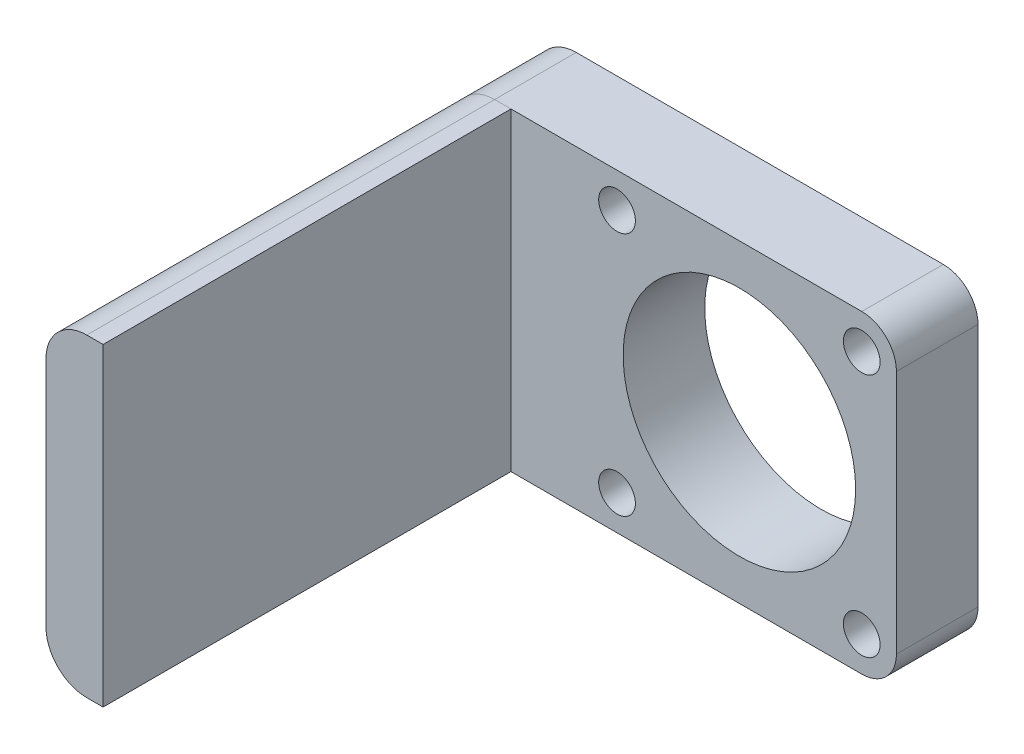
ISO-10303-21;
HEADER;
FILE_DESCRIPTION(('STEP AP214'),'2;1');
FILE_NAME('part.step','',(''),(''),'','','');
FILE_SCHEMA(('AUTOMOTIVE_DESIGN { 1 0 10303 214 1 1 1 1 }'));
ENDSEC;
DATA;
#1=APPLICATION_CONTEXT('core data for automotive mechanical design processes');
#2=APPLICATION_PROTOCOL_DEFINITION('international standard','automotive_design',2000,#1);
#3=PRODUCT_CONTEXT('',#1,'mechanical');
#4=PRODUCT('Part','Part','',(#3));
#5=PRODUCT_RELATED_PRODUCT_CATEGORY('part','',(#4));
#6=PRODUCT_DEFINITION_FORMATION('','',#4);
#7=PRODUCT_DEFINITION_CONTEXT('part definition',#1,'design');
#8=PRODUCT_DEFINITION('design','',#6,#7);
#9=PRODUCT_DEFINITION_SHAPE('','',#8);
#10=(LENGTH_UNIT() NAMED_UNIT(*) SI_UNIT(.MILLI.,.METRE.));
#11=(NAMED_UNIT(*) PLANE_ANGLE_UNIT() SI_UNIT($,.RADIAN.));
#12=(NAMED_UNIT(*) SI_UNIT($,.STERADIAN.) SOLID_ANGLE_UNIT());
#13=UNCERTAINTY_MEASURE_WITH_UNIT(LENGTH_MEASURE(1.E-05),#10,'distance_accuracy_value','');
#14=(GEOMETRIC_REPRESENTATION_CONTEXT(3) GLOBAL_UNCERTAINTY_ASSIGNED_CONTEXT((#13)) GLOBAL_UNIT_ASSIGNED_CONTEXT((#10,
#11,#12)) REPRESENTATION_CONTEXT('',''));
#15=CARTESIAN_POINT('',(0.,0.,0.));
#16=DIRECTION('',(0.,0.,1.));
#17=DIRECTION('',(1.,0.,0.));
#18=AXIS2_PLACEMENT_3D('',#15,#16,#17);
#19=CARTESIAN_POINT('',(-30.0000000000002,-14.2499999999987,60.));
#20=DIRECTION('',(0.,0.,-1.));
#21=DIRECTION('',(-1.,0.,0.));
#22=AXIS2_PLACEMENT_3D('',#19,#20,#21);
#23=CYLINDRICAL_SURFACE('',#22,5.);
#24=CARTESIAN_POINT('',(-30.0000000000002,-14.2499999999987,10.));
#25=DIRECTION('',(0.,0.,1.));
#26=DIRECTION('',(1.,0.,0.));
#27=AXIS2_PLACEMENT_3D('',#24,#25,#26);
#28=CIRCLE('',#27,5.);
#29=CARTESIAN_POINT('',(-35.0000000000002,-14.2499999999987,10.));
#30=VERTEX_POINT('',#29);
#31=CARTESIAN_POINT('',(-30.0000000000002,-19.2499999999987,10.));
#32=VERTEX_POINT('',#31);
#33=EDGE_CURVE('E129',#30,#32,#28,.T.);
#34=ORIENTED_EDGE('',*,*,#33,.T.);
#35=DIRECTION('',(0.,0.,-1.));
#36=VECTOR('',#35,1.);
#37=CARTESIAN_POINT('',(-30.0000000000002,-19.2499999999987,60.));
#38=LINE('',#37,#36);
#39=CARTESIAN_POINT('',(-30.0000000000002,-19.2499999999987,60.));
#40=VERTEX_POINT('',#39);
#41=EDGE_CURVE('E12',#40,#32,#38,.T.);
#42=ORIENTED_EDGE('',*,*,#41,.F.);
#43=CARTESIAN_POINT('',(-30.0000000000002,-14.2499999999987,60.));
#44=DIRECTION('',(0.,0.,1.));
#45=DIRECTION('',(1.,0.,0.));
#46=AXIS2_PLACEMENT_3D('',#43,#44,#45);
#47=CIRCLE('',#46,5.);
#48=CARTESIAN_POINT('',(-35.0000000000002,-14.2499999999987,60.));
#49=VERTEX_POINT('',#48);
#50=EDGE_CURVE('E140',#49,#40,#47,.T.);
#51=ORIENTED_EDGE('',*,*,#50,.F.);
#52=DIRECTION('',(0.,0.,-1.));
#53=VECTOR('',#52,1.);
#54=CARTESIAN_POINT('',(-35.0000000000002,-14.2499999999987,60.));
#55=LINE('',#54,#53);
#56=EDGE_CURVE('E125',#49,#30,#55,.T.);
#57=ORIENTED_EDGE('',*,*,#56,.T.);
#58=EDGE_LOOP('',(#34,#42,#51,#57));
#59=FACE_BOUND('',#58,.T.);
#60=ADVANCED_FACE('F45',(#59),#23,.T.);
#61=CARTESIAN_POINT('',(-30.0000000000002,-19.2499999999987,60.));
#62=DIRECTION('',(0.,1.,0.));
#63=DIRECTION('',(0.,0.,1.));
#64=AXIS2_PLACEMENT_3D('',#61,#62,#63);
#65=PLANE('',#64);
#66=DIRECTION('',(1.,0.,0.));
#67=VECTOR('',#66,1.);
#68=CARTESIAN_POINT('',(-30.0000000000002,-19.2499999999987,10.));
#69=LINE('',#68,#67);
#70=CARTESIAN_POINT('',(-28.0000000000002,-19.2499999999987,10.));
#71=VERTEX_POINT('',#70);
#72=EDGE_CURVE('E132',#32,#71,#69,.T.);
#73=ORIENTED_EDGE('',*,*,#72,.T.);
#74=DIRECTION('',(0.,0.,-1.));
#75=VECTOR('',#74,1.);
#76=CARTESIAN_POINT('',(-28.0000000000002,-19.2499999999987,60.));
#77=LINE('',#76,#75);
#78=CARTESIAN_POINT('',(-28.0000000000002,-19.2499999999987,60.));
#79=VERTEX_POINT('',#78);
#80=EDGE_CURVE('E53',#79,#71,#77,.T.);
#81=ORIENTED_EDGE('',*,*,#80,.F.);
#82=DIRECTION('',(1.,0.,0.));
#83=VECTOR('',#82,1.);
#84=CARTESIAN_POINT('',(-30.0000000000002,-19.2499999999987,60.));
#85=LINE('',#84,#83);
#86=EDGE_CURVE('E98',#40,#79,#85,.T.);
#87=ORIENTED_EDGE('',*,*,#86,.F.);
#88=ORIENTED_EDGE('',*,*,#41,.T.);
#89=EDGE_LOOP('',(#73,#81,#87,#88));
#90=FACE_BOUND('',#89,.T.);
#91=ADVANCED_FACE('F146',(#90),#65,.F.);
#92=CARTESIAN_POINT('',(-28.0000000000002,0.,60.));
#93=DIRECTION('',(-1.,0.,0.));
#94=DIRECTION('',(0.,0.,1.));
#95=AXIS2_PLACEMENT_3D('',#92,#93,#94);
#96=PLANE('',#95);
#97=DIRECTION('',(0.,1.,0.));
#98=VECTOR('',#97,1.);
#99=CARTESIAN_POINT('',(-28.0000000000002,0.,10.));
#100=LINE('',#99,#98);
#101=CARTESIAN_POINT('',(-28.0000000000002,19.2499999999982,10.));
#102=VERTEX_POINT('',#101);
#103=EDGE_CURVE('E135',#71,#102,#100,.T.);
#104=ORIENTED_EDGE('',*,*,#103,.T.);
#105=DIRECTION('',(0.,0.,-1.));
#106=VECTOR('',#105,1.);
#107=CARTESIAN_POINT('',(-28.0000000000002,19.2499999999982,60.));
#108=LINE('',#107,#106);
#109=CARTESIAN_POINT('',(-28.0000000000002,19.2499999999982,60.));
#110=VERTEX_POINT('',#109);
#111=EDGE_CURVE('E120',#110,#102,#108,.T.);
#112=ORIENTED_EDGE('',*,*,#111,.F.);
#113=DIRECTION('',(0.,1.,0.));
#114=VECTOR('',#113,1.);
#115=CARTESIAN_POINT('',(-28.0000000000002,0.,60.));
#116=LINE('',#115,#114);
#117=EDGE_CURVE('E111',#79,#110,#116,.T.);
#118=ORIENTED_EDGE('',*,*,#117,.F.);
#119=ORIENTED_EDGE('',*,*,#80,.T.);
#120=EDGE_LOOP('',(#104,#112,#118,#119));
#121=FACE_BOUND('',#120,.T.);
#122=ADVANCED_FACE('F145',(#121),#96,.F.);
#123=CARTESIAN_POINT('',(-28.0000000000002,19.2499999999982,60.));
#124=DIRECTION('',(0.,-1.,0.));
#125=DIRECTION('',(0.,0.,-1.));
#126=AXIS2_PLACEMENT_3D('',#123,#124,#125);
#127=PLANE('',#126);
#128=DIRECTION('',(-1.,0.,0.));
#129=VECTOR('',#128,1.);
#130=CARTESIAN_POINT('',(-28.0000000000002,19.2499999999982,10.));
#131=LINE('',#130,#129);
#132=CARTESIAN_POINT('',(-30.0000000000002,19.2499999999982,10.));
#133=VERTEX_POINT('',#132);
#134=EDGE_CURVE('E119',#102,#133,#131,.T.);
#135=ORIENTED_EDGE('',*,*,#134,.T.);
#136=DIRECTION('',(0.,0.,-1.));
#137=VECTOR('',#136,1.);
#138=CARTESIAN_POINT('',(-30.0000000000002,19.2499999999982,60.));
#139=LINE('',#138,#137);
#140=CARTESIAN_POINT('',(-30.0000000000002,19.2499999999982,60.));
#141=VERTEX_POINT('',#140);
#142=EDGE_CURVE('E116',#141,#133,#139,.T.);
#143=ORIENTED_EDGE('',*,*,#142,.F.);
#144=DIRECTION('',(-1.,0.,0.));
#145=VECTOR('',#144,1.);
#146=CARTESIAN_POINT('',(-28.0000000000002,19.2499999999982,60.));
#147=LINE('',#146,#145);
#148=EDGE_CURVE('E105',#110,#141,#147,.T.);
#149=ORIENTED_EDGE('',*,*,#148,.F.);
#150=ORIENTED_EDGE('',*,*,#111,.T.);
#151=EDGE_LOOP('',(#135,#143,#149,#150));
#152=FACE_BOUND('',#151,.T.);
#153=ADVANCED_FACE('F117',(#152),#127,.F.);
#154=CARTESIAN_POINT('',(-30.0000000000002,14.2499999999982,60.));
#155=DIRECTION('',(0.,0.,-1.));
#156=DIRECTION('',(-1.,0.,0.));
#157=AXIS2_PLACEMENT_3D('',#154,#155,#156);
#158=CYLINDRICAL_SURFACE('',#157,5.);
#159=CARTESIAN_POINT('',(-30.0000000000002,14.2499999999982,10.));
#160=DIRECTION('',(0.,0.,1.));
#161=DIRECTION('',(1.,0.,0.));
#162=AXIS2_PLACEMENT_3D('',#159,#160,#161);
#163=CIRCLE('',#162,5.);
#164=CARTESIAN_POINT('',(-35.0000000000002,14.2499999999981,10.));
#165=VERTEX_POINT('',#164);
#166=EDGE_CURVE('E84',#133,#165,#163,.T.);
#167=ORIENTED_EDGE('',*,*,#166,.T.);
#168=DIRECTION('',(0.,0.,-1.));
#169=VECTOR('',#168,1.);
#170=CARTESIAN_POINT('',(-35.0000000000002,14.2499999999981,60.));
#171=LINE('',#170,#169);
#172=CARTESIAN_POINT('',(-35.0000000000002,14.2499999999981,60.));
#173=VERTEX_POINT('',#172);
#174=EDGE_CURVE('E121',#173,#165,#171,.T.);
#175=ORIENTED_EDGE('',*,*,#174,.F.);
#176=CARTESIAN_POINT('',(-30.0000000000002,14.2499999999982,60.));
#177=DIRECTION('',(0.,0.,1.));
#178=DIRECTION('',(1.,0.,0.));
#179=AXIS2_PLACEMENT_3D('',#176,#177,#178);
#180=CIRCLE('',#179,5.);
#181=EDGE_CURVE('E109',#141,#173,#180,.T.);
#182=ORIENTED_EDGE('',*,*,#181,.F.);
#183=ORIENTED_EDGE('',*,*,#142,.T.);
#184=EDGE_LOOP('',(#167,#175,#182,#183));
#185=FACE_BOUND('',#184,.T.);
#186=ADVANCED_FACE('F123',(#185),#158,.T.);
#187=CARTESIAN_POINT('',(-35.0000000000002,14.2499999999981,60.));
#188=DIRECTION('',(1.,0.,0.));
#189=DIRECTION('',(0.,0.,-1.));
#190=AXIS2_PLACEMENT_3D('',#187,#188,#189);
#191=PLANE('',#190);
#192=DIRECTION('',(0.,-1.,0.));
#193=VECTOR('',#192,1.);
#194=CARTESIAN_POINT('',(-35.0000000000002,14.2499999999981,10.));
#195=LINE('',#194,#193);
#196=EDGE_CURVE('E90',#165,#30,#195,.T.);
#197=ORIENTED_EDGE('',*,*,#196,.T.);
#198=ORIENTED_EDGE('',*,*,#56,.F.);
#199=DIRECTION('',(0.,-1.,0.));
#200=VECTOR('',#199,1.);
#201=CARTESIAN_POINT('',(-35.0000000000002,14.2499999999981,60.));
#202=LINE('',#201,#200);
#203=EDGE_CURVE('E61',#173,#49,#202,.T.);
#204=ORIENTED_EDGE('',*,*,#203,.F.);
#205=ORIENTED_EDGE('',*,*,#174,.T.);
#206=EDGE_LOOP('',(#197,#198,#204,#205));
#207=FACE_BOUND('',#206,.T.);
#208=ADVANCED_FACE('F153',(#207),#191,.F.);
#209=CARTESIAN_POINT('',(-30.0000000000002,-14.2499999999987,60.));
#210=DIRECTION('',(0.,0.,1.));
#211=DIRECTION('',(1.,0.,0.));
#212=AXIS2_PLACEMENT_3D('',#209,#210,#211);
#213=PLANE('',#212);
#214=ORIENTED_EDGE('',*,*,#50,.T.);
#215=ORIENTED_EDGE('',*,*,#86,.T.);
#216=ORIENTED_EDGE('',*,*,#117,.T.);
#217=ORIENTED_EDGE('',*,*,#148,.T.);
#218=ORIENTED_EDGE('',*,*,#181,.T.);
#219=ORIENTED_EDGE('',*,*,#203,.T.);
#220=EDGE_LOOP('',(#214,#215,#216,#217,#218,#219));
#221=FACE_BOUND('',#220,.T.);
#222=ADVANCED_FACE('F107',(#221),#213,.T.);
#223=CARTESIAN_POINT('',(-30.0000000000002,-14.2499999999987,10.));
#224=DIRECTION('',(0.,0.,1.));
#225=DIRECTION('',(1.,0.,0.));
#226=AXIS2_PLACEMENT_3D('',#223,#224,#225);
#227=PLANE('',#226);
#228=ORIENTED_EDGE('',*,*,#33,.F.);
#229=ORIENTED_EDGE('',*,*,#196,.F.);
#230=ORIENTED_EDGE('',*,*,#166,.F.);
#231=ORIENTED_EDGE('',*,*,#134,.F.);
#232=ORIENTED_EDGE('',*,*,#103,.F.);
#233=ORIENTED_EDGE('',*,*,#72,.F.);
#234=EDGE_LOOP('',(#228,#229,#230,#231,#232,#233));
#235=FACE_BOUND('',#234,.T.);
#236=ADVANCED_FACE('F150',(#235),#227,.F.);
#237=CLOSED_SHELL('',(#60,#91,#122,#153,#186,#208,#222,#236));
#238=MANIFOLD_SOLID_BREP('B2',#237);
#239=CARTESIAN_POINT('',(0.,19.2499999999982,10.));
#240=DIRECTION('',(0.,-1.,0.));
#241=DIRECTION('',(0.,0.,-1.));
#242=AXIS2_PLACEMENT_3D('',#239,#240,#241);
#243=PLANE('',#242);
#244=DIRECTION('',(-1.,0.,0.));
#245=VECTOR('',#244,1.);
#246=CARTESIAN_POINT('',(0.,19.2499999999982,0.));
#247=LINE('',#246,#245);
#248=CARTESIAN_POINT('',(15.0000000000002,19.2499999999982,0.));
#249=VERTEX_POINT('',#248);
#250=CARTESIAN_POINT('',(-30.0000000000002,19.2499999999982,0.));
#251=VERTEX_POINT('',#250);
#252=EDGE_CURVE('E336',#249,#251,#247,.T.);
#253=ORIENTED_EDGE('',*,*,#252,.T.);
#254=DIRECTION('',(0.,0.,-1.));
#255=VECTOR('',#254,1.);
#256=CARTESIAN_POINT('',(-30.0000000000002,19.2499999999982,10.));
#257=LINE('',#256,#255);
#258=CARTESIAN_POINT('',(-30.0000000000002,19.2499999999982,10.));
#259=VERTEX_POINT('',#258);
#260=EDGE_CURVE('E43',#259,#251,#257,.T.);
#261=ORIENTED_EDGE('',*,*,#260,.F.);
#262=DIRECTION('',(-1.,0.,0.));
#263=VECTOR('',#262,1.);
#264=CARTESIAN_POINT('',(0.,19.2499999999982,10.));
#265=LINE('',#264,#263);
#266=CARTESIAN_POINT('',(15.0000000000002,19.2499999999982,10.));
#267=VERTEX_POINT('',#266);
#268=EDGE_CURVE('E380',#267,#259,#265,.T.);
#269=ORIENTED_EDGE('',*,*,#268,.F.);
#270=DIRECTION('',(0.,0.,-1.));
#271=VECTOR('',#270,1.);
#272=CARTESIAN_POINT('',(15.0000000000002,19.2499999999982,10.));
#273=LINE('',#272,#271);
#274=EDGE_CURVE('E317',#267,#249,#273,.T.);
#275=ORIENTED_EDGE('',*,*,#274,.T.);
#276=EDGE_LOOP('',(#253,#261,#269,#275));
#277=FACE_BOUND('',#276,.T.);
#278=ADVANCED_FACE('F224',(#277),#243,.F.);
#279=CARTESIAN_POINT('',(-30.0000000000002,14.2499999999982,10.));
#280=DIRECTION('',(0.,0.,-1.));
#281=DIRECTION('',(-1.,0.,0.));
#282=AXIS2_PLACEMENT_3D('',#279,#280,#281);
#283=CYLINDRICAL_SURFACE('',#282,5.);
#284=CARTESIAN_POINT('',(-30.0000000000002,14.2499999999982,0.));
#285=DIRECTION('',(0.,0.,1.));
#286=DIRECTION('',(1.,0.,0.));
#287=AXIS2_PLACEMENT_3D('',#284,#285,#286);
#288=CIRCLE('',#287,5.);
#289=CARTESIAN_POINT('',(-35.0000000000002,14.2499999999981,0.));
#290=VERTEX_POINT('',#289);
#291=EDGE_CURVE('E339',#251,#290,#288,.T.);
#292=ORIENTED_EDGE('',*,*,#291,.T.);
#293=DIRECTION('',(0.,0.,-1.));
#294=VECTOR('',#293,1.);
#295=CARTESIAN_POINT('',(-35.0000000000002,14.2499999999981,10.));
#296=LINE('',#295,#294);
#297=CARTESIAN_POINT('',(-35.0000000000002,14.2499999999981,10.));
#298=VERTEX_POINT('',#297);
#299=EDGE_CURVE('E233',#298,#290,#296,.T.);
#300=ORIENTED_EDGE('',*,*,#299,.F.);
#301=CARTESIAN_POINT('',(-30.0000000000002,14.2499999999982,10.));
#302=DIRECTION('',(0.,0.,1.));
#303=DIRECTION('',(1.,0.,0.));
#304=AXIS2_PLACEMENT_3D('',#301,#302,#303);
#305=CIRCLE('',#304,5.);
#306=EDGE_CURVE('E280',#259,#298,#305,.T.);
#307=ORIENTED_EDGE('',*,*,#306,.F.);
#308=ORIENTED_EDGE('',*,*,#260,.T.);
#309=EDGE_LOOP('',(#292,#300,#307,#308));
#310=FACE_BOUND('',#309,.T.);
#311=ADVANCED_FACE('F426',(#310),#283,.T.);
#312=CARTESIAN_POINT('',(-35.0000000000002,0.,10.));
#313=DIRECTION('',(1.,0.,0.));
#314=DIRECTION('',(0.,0.,-1.));
#315=AXIS2_PLACEMENT_3D('',#312,#313,#314);
#316=PLANE('',#315);
#317=DIRECTION('',(0.,-1.,0.));
#318=VECTOR('',#317,1.);
#319=CARTESIAN_POINT('',(-35.0000000000002,0.,0.));
#320=LINE('',#319,#318);
#321=CARTESIAN_POINT('',(-35.0000000000002,-14.2499999999987,0.));
#322=VERTEX_POINT('',#321);
#323=EDGE_CURVE('E341',#290,#322,#320,.T.);
#324=ORIENTED_EDGE('',*,*,#323,.T.);
#325=DIRECTION('',(0.,0.,-1.));
#326=VECTOR('',#325,1.);
#327=CARTESIAN_POINT('',(-35.0000000000002,-14.2499999999987,10.));
#328=LINE('',#327,#326);
#329=CARTESIAN_POINT('',(-35.0000000000002,-14.2499999999987,10.));
#330=VERTEX_POINT('',#329);
#331=EDGE_CURVE('E359',#330,#322,#328,.T.);
#332=ORIENTED_EDGE('',*,*,#331,.F.);
#333=DIRECTION('',(0.,-1.,0.));
#334=VECTOR('',#333,1.);
#335=CARTESIAN_POINT('',(-35.0000000000002,0.,10.));
#336=LINE('',#335,#334);
#337=EDGE_CURVE('E366',#298,#330,#336,.T.);
#338=ORIENTED_EDGE('',*,*,#337,.F.);
#339=ORIENTED_EDGE('',*,*,#299,.T.);
#340=EDGE_LOOP('',(#324,#332,#338,#339));
#341=FACE_BOUND('',#340,.T.);
#342=ADVANCED_FACE('F364',(#341),#316,.F.);
#343=CARTESIAN_POINT('',(-30.0000000000002,-14.2499999999987,10.));
#344=DIRECTION('',(0.,0.,-1.));
#345=DIRECTION('',(-1.,0.,0.));
#346=AXIS2_PLACEMENT_3D('',#343,#344,#345);
#347=CYLINDRICAL_SURFACE('',#346,5.);
#348=CARTESIAN_POINT('',(-30.0000000000002,-14.2499999999987,0.));
#349=DIRECTION('',(0.,0.,1.));
#350=DIRECTION('',(1.,0.,0.));
#351=AXIS2_PLACEMENT_3D('',#348,#349,#350);
#352=CIRCLE('',#351,5.);
#353=CARTESIAN_POINT('',(-30.0000000000002,-19.2499999999987,0.));
#354=VERTEX_POINT('',#353);
#355=EDGE_CURVE('E344',#354,#322,#352,.F.);
#356=ORIENTED_EDGE('',*,*,#355,.F.);
#357=DIRECTION('',(0.,0.,-1.));
#358=VECTOR('',#357,1.);
#359=CARTESIAN_POINT('',(-30.0000000000002,-19.2499999999987,10.));
#360=LINE('',#359,#358);
#361=CARTESIAN_POINT('',(-30.0000000000002,-19.2499999999987,10.));
#362=VERTEX_POINT('',#361);
#363=EDGE_CURVE('E357',#362,#354,#360,.T.);
#364=ORIENTED_EDGE('',*,*,#363,.F.);
#365=CARTESIAN_POINT('',(-30.0000000000002,-14.2499999999987,10.));
#366=DIRECTION('',(0.,0.,1.));
#367=DIRECTION('',(1.,0.,0.));
#368=AXIS2_PLACEMENT_3D('',#365,#366,#367);
#369=CIRCLE('',#368,5.);
#370=EDGE_CURVE('E375',#362,#330,#369,.F.);
#371=ORIENTED_EDGE('',*,*,#370,.T.);
#372=ORIENTED_EDGE('',*,*,#331,.T.);
#373=EDGE_LOOP('',(#356,#364,#371,#372));
#374=FACE_BOUND('',#373,.T.);
#375=ADVANCED_FACE('F373',(#374),#347,.T.);
#376=CARTESIAN_POINT('',(0.,-19.2499999999987,10.));
#377=DIRECTION('',(0.,1.,0.));
#378=DIRECTION('',(0.,0.,1.));
#379=AXIS2_PLACEMENT_3D('',#376,#377,#378);
#380=PLANE('',#379);
#381=DIRECTION('',(1.,0.,0.));
#382=VECTOR('',#381,1.);
#383=CARTESIAN_POINT('',(0.,-19.2499999999987,0.));
#384=LINE('',#383,#382);
#385=CARTESIAN_POINT('',(15.0000000000002,-19.2499999999987,0.));
#386=VERTEX_POINT('',#385);
#387=EDGE_CURVE('E347',#354,#386,#384,.T.);
#388=ORIENTED_EDGE('',*,*,#387,.T.);
#389=DIRECTION('',(0.,0.,-1.));
#390=VECTOR('',#389,1.);
#391=CARTESIAN_POINT('',(15.0000000000002,-19.2499999999987,10.));
#392=LINE('',#391,#390);
#393=CARTESIAN_POINT('',(15.0000000000002,-19.2499999999987,10.));
#394=VERTEX_POINT('',#393);
#395=EDGE_CURVE('E313',#394,#386,#392,.T.);
#396=ORIENTED_EDGE('',*,*,#395,.F.);
#397=DIRECTION('',(1.,0.,0.));
#398=VECTOR('',#397,1.);
#399=CARTESIAN_POINT('',(0.,-19.2499999999987,10.));
#400=LINE('',#399,#398);
#401=EDGE_CURVE('E300',#362,#394,#400,.T.);
#402=ORIENTED_EDGE('',*,*,#401,.F.);
#403=ORIENTED_EDGE('',*,*,#363,.T.);
#404=EDGE_LOOP('',(#388,#396,#402,#403));
#405=FACE_BOUND('',#404,.T.);
#406=ADVANCED_FACE('F465',(#405),#380,.F.);
#407=CARTESIAN_POINT('',(15.0000000000002,-14.9999999999982,10.));
#408=DIRECTION('',(0.,0.,-1.));
#409=DIRECTION('',(-1.,0.,0.));
#410=AXIS2_PLACEMENT_3D('',#407,#408,#409);
#411=CYLINDRICAL_SURFACE('',#410,4.25000000000049);
#412=CARTESIAN_POINT('',(15.0000000000002,-14.9999999999982,0.));
#413=DIRECTION('',(0.,0.,1.));
#414=DIRECTION('',(1.,0.,0.));
#415=AXIS2_PLACEMENT_3D('',#412,#413,#414);
#416=CIRCLE('',#415,4.25000000000049);
#417=CARTESIAN_POINT('',(19.2500000000007,-15.0000000000027,0.));
#418=VERTEX_POINT('',#417);
#419=EDGE_CURVE('E309',#386,#418,#416,.T.);
#420=ORIENTED_EDGE('',*,*,#419,.T.);
#421=DIRECTION('',(0.,0.,-1.));
#422=VECTOR('',#421,1.);
#423=CARTESIAN_POINT('',(19.2500000000007,-15.0000000000027,10.));
#424=LINE('',#423,#422);
#425=CARTESIAN_POINT('',(19.2500000000007,-15.0000000000027,10.));
#426=VERTEX_POINT('',#425);
#427=EDGE_CURVE('E306',#426,#418,#424,.T.);
#428=ORIENTED_EDGE('',*,*,#427,.F.);
#429=CARTESIAN_POINT('',(15.0000000000002,-14.9999999999982,10.));
#430=DIRECTION('',(0.,0.,1.));
#431=DIRECTION('',(1.,0.,0.));
#432=AXIS2_PLACEMENT_3D('',#429,#430,#431);
#433=CIRCLE('',#432,4.25000000000049);
#434=EDGE_CURVE('E293',#394,#426,#433,.T.);
#435=ORIENTED_EDGE('',*,*,#434,.F.);
#436=ORIENTED_EDGE('',*,*,#395,.T.);
#437=EDGE_LOOP('',(#420,#428,#435,#436));
#438=FACE_BOUND('',#437,.T.);
#439=ADVANCED_FACE('F307',(#438),#411,.T.);
#440=CARTESIAN_POINT('',(19.2500000000007,0.,10.));
#441=DIRECTION('',(1.,0.,0.));
#442=DIRECTION('',(0.,0.,-1.));
#443=AXIS2_PLACEMENT_3D('',#440,#441,#442);
#444=PLANE('',#443);
#445=DIRECTION('',(0.,-1.,0.));
#446=VECTOR('',#445,1.);
#447=CARTESIAN_POINT('',(19.2500000000007,0.,0.));
#448=LINE('',#447,#446);
#449=CARTESIAN_POINT('',(19.2500000000007,14.9999999999977,0.));
#450=VERTEX_POINT('',#449);
#451=EDGE_CURVE('E350',#450,#418,#448,.T.);
#452=ORIENTED_EDGE('',*,*,#451,.F.);
#453=DIRECTION('',(0.,0.,-1.));
#454=VECTOR('',#453,1.);
#455=CARTESIAN_POINT('',(19.2500000000007,14.9999999999977,10.));
#456=LINE('',#455,#454);
#457=CARTESIAN_POINT('',(19.2500000000007,14.9999999999977,10.));
#458=VERTEX_POINT('',#457);
#459=EDGE_CURVE('E269',#458,#450,#456,.T.);
#460=ORIENTED_EDGE('',*,*,#459,.F.);
#461=DIRECTION('',(0.,-1.,0.));
#462=VECTOR('',#461,1.);
#463=CARTESIAN_POINT('',(19.2500000000007,0.,10.));
#464=LINE('',#463,#462);
#465=EDGE_CURVE('E297',#458,#426,#464,.T.);
#466=ORIENTED_EDGE('',*,*,#465,.T.);
#467=ORIENTED_EDGE('',*,*,#427,.T.);
#468=EDGE_LOOP('',(#452,#460,#466,#467));
#469=FACE_BOUND('',#468,.T.);
#470=ADVANCED_FACE('F315',(#469),#444,.T.);
#471=CARTESIAN_POINT('',(15.0000000000002,-14.9999999999982,10.));
#472=DIRECTION('',(0.,0.,-1.));
#473=DIRECTION('',(-1.,0.,0.));
#474=AXIS2_PLACEMENT_3D('',#471,#472,#473);
#475=CYLINDRICAL_SURFACE('',#474,2.24999999999958);
#476=CARTESIAN_POINT('',(15.0000000000002,-14.9999999999982,10.));
#477=DIRECTION('',(0.,0.,1.));
#478=DIRECTION('',(1.,0.,0.));
#479=AXIS2_PLACEMENT_3D('',#476,#477,#478);
#480=CIRCLE('',#479,2.24999999999958);
#481=CARTESIAN_POINT('',(17.2499999999998,-14.9999999999982,10.));
#482=VERTEX_POINT('',#481);
#483=EDGE_CURVE('E382',#482,#482,#480,.T.);
#484=ORIENTED_EDGE('',*,*,#483,.T.);
#485=EDGE_LOOP('',(#484));
#486=FACE_BOUND('',#485,.T.);
#487=CARTESIAN_POINT('',(15.0000000000002,-14.9999999999982,0.));
#488=DIRECTION('',(0.,0.,1.));
#489=DIRECTION('',(1.,0.,0.));
#490=AXIS2_PLACEMENT_3D('',#487,#488,#489);
#491=CIRCLE('',#490,2.24999999999958);
#492=CARTESIAN_POINT('',(17.2499999999998,-14.9999999999982,0.));
#493=VERTEX_POINT('',#492);
#494=EDGE_CURVE('E333',#493,#493,#491,.T.);
#495=ORIENTED_EDGE('',*,*,#494,.F.);
#496=EDGE_LOOP('',(#495));
#497=FACE_BOUND('',#496,.T.);
#498=ADVANCED_FACE('F411',(#486,#497),#475,.F.);
#499=CARTESIAN_POINT('',(-14.999999999995,-14.9999999999984,10.));
#500=DIRECTION('',(0.,0.,-1.));
#501=DIRECTION('',(-1.,0.,0.));
#502=AXIS2_PLACEMENT_3D('',#499,#500,#501);
#503=CYLINDRICAL_SURFACE('',#502,2.24999999999502);
#504=CARTESIAN_POINT('',(-14.999999999995,-14.9999999999984,10.));
#505=DIRECTION('',(0.,0.,1.));
#506=DIRECTION('',(1.,0.,0.));
#507=AXIS2_PLACEMENT_3D('',#504,#505,#506);
#508=CIRCLE('',#507,2.24999999999502);
#509=CARTESIAN_POINT('',(-12.75,-14.9999999999984,10.));
#510=VERTEX_POINT('',#509);
#511=EDGE_CURVE('E385',#510,#510,#508,.T.);
#512=ORIENTED_EDGE('',*,*,#511,.T.);
#513=EDGE_LOOP('',(#512));
#514=FACE_BOUND('',#513,.T.);
#515=CARTESIAN_POINT('',(-14.999999999995,-14.9999999999984,0.));
#516=DIRECTION('',(0.,0.,1.));
#517=DIRECTION('',(1.,0.,0.));
#518=AXIS2_PLACEMENT_3D('',#515,#516,#517);
#519=CIRCLE('',#518,2.24999999999502);
#520=CARTESIAN_POINT('',(-12.75,-14.9999999999984,0.));
#521=VERTEX_POINT('',#520);
#522=EDGE_CURVE('E330',#521,#521,#519,.T.);
#523=ORIENTED_EDGE('',*,*,#522,.F.);
#524=EDGE_LOOP('',(#523));
#525=FACE_BOUND('',#524,.T.);
#526=ADVANCED_FACE('F414',(#514,#525),#503,.F.);
#527=CARTESIAN_POINT('',(-14.999999999995,14.9999999999975,10.));
#528=DIRECTION('',(0.,0.,-1.));
#529=DIRECTION('',(-1.,0.,0.));
#530=AXIS2_PLACEMENT_3D('',#527,#528,#529);
#531=CYLINDRICAL_SURFACE('',#530,2.24999999999594);
#532=CARTESIAN_POINT('',(-14.999999999995,14.9999999999975,10.));
#533=DIRECTION('',(0.,0.,1.));
#534=DIRECTION('',(1.,0.,0.));
#535=AXIS2_PLACEMENT_3D('',#532,#533,#534);
#536=CIRCLE('',#535,2.24999999999594);
#537=CARTESIAN_POINT('',(-12.7499999999991,14.9999999999975,10.));
#538=VERTEX_POINT('',#537);
#539=EDGE_CURVE('E388',#538,#538,#536,.T.);
#540=ORIENTED_EDGE('',*,*,#539,.T.);
#541=EDGE_LOOP('',(#540));
#542=FACE_BOUND('',#541,.T.);
#543=CARTESIAN_POINT('',(-14.999999999995,14.9999999999975,0.));
#544=DIRECTION('',(0.,0.,1.));
#545=DIRECTION('',(1.,0.,0.));
#546=AXIS2_PLACEMENT_3D('',#543,#544,#545);
#547=CIRCLE('',#546,2.24999999999594);
#548=CARTESIAN_POINT('',(-12.7499999999991,14.9999999999975,0.));
#549=VERTEX_POINT('',#548);
#550=EDGE_CURVE('E327',#549,#549,#547,.T.);
#551=ORIENTED_EDGE('',*,*,#550,.F.);
#552=EDGE_LOOP('',(#551));
#553=FACE_BOUND('',#552,.T.);
#554=ADVANCED_FACE('F437',(#542,#553),#531,.F.);
#555=CARTESIAN_POINT('',(15.0000000000002,14.9999999999977,10.));
#556=DIRECTION('',(0.,0.,-1.));
#557=DIRECTION('',(-1.,0.,0.));
#558=AXIS2_PLACEMENT_3D('',#555,#556,#557);
#559=CYLINDRICAL_SURFACE('',#558,2.25000000000049);
#560=CARTESIAN_POINT('',(15.0000000000002,14.9999999999977,10.));
#561=DIRECTION('',(0.,0.,1.));
#562=DIRECTION('',(1.,0.,0.));
#563=AXIS2_PLACEMENT_3D('',#560,#561,#562);
#564=CIRCLE('',#563,2.25000000000049);
#565=CARTESIAN_POINT('',(17.2500000000007,14.9999999999977,10.));
#566=VERTEX_POINT('',#565);
#567=EDGE_CURVE('E391',#566,#566,#564,.T.);
#568=ORIENTED_EDGE('',*,*,#567,.T.);
#569=EDGE_LOOP('',(#568));
#570=FACE_BOUND('',#569,.T.);
#571=CARTESIAN_POINT('',(15.0000000000002,14.9999999999977,0.));
#572=DIRECTION('',(0.,0.,1.));
#573=DIRECTION('',(1.,0.,0.));
#574=AXIS2_PLACEMENT_3D('',#571,#572,#573);
#575=CIRCLE('',#574,2.25000000000049);
#576=CARTESIAN_POINT('',(17.2500000000007,14.9999999999977,0.));
#577=VERTEX_POINT('',#576);
#578=EDGE_CURVE('E324',#577,#577,#575,.T.);
#579=ORIENTED_EDGE('',*,*,#578,.F.);
#580=EDGE_LOOP('',(#579));
#581=FACE_BOUND('',#580,.T.);
#582=ADVANCED_FACE('F440',(#570,#581),#559,.F.);
#583=CARTESIAN_POINT('',(0.,0.,10.));
#584=DIRECTION('',(0.,0.,-1.));
#585=DIRECTION('',(-1.,0.,0.));
#586=AXIS2_PLACEMENT_3D('',#583,#584,#585);
#587=CYLINDRICAL_SURFACE('',#586,14.25);
#588=CARTESIAN_POINT('',(0.,0.,10.));
#589=DIRECTION('',(0.,0.,1.));
#590=DIRECTION('',(1.,0.,0.));
#591=AXIS2_PLACEMENT_3D('',#588,#589,#590);
#592=CIRCLE('',#591,14.25);
#593=CARTESIAN_POINT('',(14.25,0.,10.));
#594=VERTEX_POINT('',#593);
#595=EDGE_CURVE('E353',#594,#594,#592,.T.);
#596=ORIENTED_EDGE('',*,*,#595,.T.);
#597=EDGE_LOOP('',(#596));
#598=FACE_BOUND('',#597,.T.);
#599=CARTESIAN_POINT('',(0.,0.,0.));
#600=DIRECTION('',(0.,0.,1.));
#601=DIRECTION('',(1.,0.,0.));
#602=AXIS2_PLACEMENT_3D('',#599,#600,#601);
#603=CIRCLE('',#602,14.25);
#604=CARTESIAN_POINT('',(14.25,0.,0.));
#605=VERTEX_POINT('',#604);
#606=EDGE_CURVE('E321',#605,#605,#603,.T.);
#607=ORIENTED_EDGE('',*,*,#606,.F.);
#608=EDGE_LOOP('',(#607));
#609=FACE_BOUND('',#608,.T.);
#610=ADVANCED_FACE('F226',(#598,#609),#587,.F.);
#611=CARTESIAN_POINT('',(15.0000000000002,14.9999999999977,10.));
#612=DIRECTION('',(0.,0.,-1.));
#613=DIRECTION('',(-1.,0.,0.));
#614=AXIS2_PLACEMENT_3D('',#611,#612,#613);
#615=CYLINDRICAL_SURFACE('',#614,4.25000000000049);
#616=CARTESIAN_POINT('',(15.0000000000002,14.9999999999977,0.));
#617=DIRECTION('',(0.,0.,1.));
#618=DIRECTION('',(1.,0.,0.));
#619=AXIS2_PLACEMENT_3D('',#616,#617,#618);
#620=CIRCLE('',#619,4.25000000000049);
#621=EDGE_CURVE('E272',#450,#249,#620,.T.);
#622=ORIENTED_EDGE('',*,*,#621,.T.);
#623=ORIENTED_EDGE('',*,*,#274,.F.);
#624=CARTESIAN_POINT('',(15.0000000000002,14.9999999999977,10.));
#625=DIRECTION('',(0.,0.,1.));
#626=DIRECTION('',(1.,0.,0.));
#627=AXIS2_PLACEMENT_3D('',#624,#625,#626);
#628=CIRCLE('',#627,4.25000000000049);
#629=EDGE_CURVE('E241',#458,#267,#628,.T.);
#630=ORIENTED_EDGE('',*,*,#629,.F.);
#631=ORIENTED_EDGE('',*,*,#459,.T.);
#632=EDGE_LOOP('',(#622,#623,#630,#631));
#633=FACE_BOUND('',#632,.T.);
#634=ADVANCED_FACE('F401',(#633),#615,.T.);
#635=CARTESIAN_POINT('',(0.,0.,10.));
#636=DIRECTION('',(0.,0.,1.));
#637=DIRECTION('',(1.,0.,0.));
#638=AXIS2_PLACEMENT_3D('',#635,#636,#637);
#639=PLANE('',#638);
#640=ORIENTED_EDGE('',*,*,#595,.F.);
#641=EDGE_LOOP('',(#640));
#642=FACE_BOUND('',#641,.T.);
#643=ORIENTED_EDGE('',*,*,#567,.F.);
#644=EDGE_LOOP('',(#643));
#645=FACE_BOUND('',#644,.T.);
#646=ORIENTED_EDGE('',*,*,#539,.F.);
#647=EDGE_LOOP('',(#646));
#648=FACE_BOUND('',#647,.T.);
#649=ORIENTED_EDGE('',*,*,#511,.F.);
#650=EDGE_LOOP('',(#649));
#651=FACE_BOUND('',#650,.T.);
#652=ORIENTED_EDGE('',*,*,#483,.F.);
#653=EDGE_LOOP('',(#652));
#654=FACE_BOUND('',#653,.T.);
#655=ORIENTED_EDGE('',*,*,#268,.T.);
#656=ORIENTED_EDGE('',*,*,#306,.T.);
#657=ORIENTED_EDGE('',*,*,#337,.T.);
#658=ORIENTED_EDGE('',*,*,#370,.F.);
#659=ORIENTED_EDGE('',*,*,#401,.T.);
#660=ORIENTED_EDGE('',*,*,#434,.T.);
#661=ORIENTED_EDGE('',*,*,#465,.F.);
#662=ORIENTED_EDGE('',*,*,#629,.T.);
#663=EDGE_LOOP('',(#655,#656,#657,#658,#659,#660,#661,#662));
#664=FACE_BOUND('',#663,.T.);
#665=ADVANCED_FACE('F295',(#642,#645,#648,#651,#654,#664),#639,.T.);
#666=CARTESIAN_POINT('',(0.,0.,0.));
#667=DIRECTION('',(0.,0.,1.));
#668=DIRECTION('',(1.,0.,0.));
#669=AXIS2_PLACEMENT_3D('',#666,#667,#668);
#670=PLANE('',#669);
#671=ORIENTED_EDGE('',*,*,#606,.T.);
#672=EDGE_LOOP('',(#671));
#673=FACE_BOUND('',#672,.T.);
#674=ORIENTED_EDGE('',*,*,#578,.T.);
#675=EDGE_LOOP('',(#674));
#676=FACE_BOUND('',#675,.T.);
#677=ORIENTED_EDGE('',*,*,#550,.T.);
#678=EDGE_LOOP('',(#677));
#679=FACE_BOUND('',#678,.T.);
#680=ORIENTED_EDGE('',*,*,#522,.T.);
#681=EDGE_LOOP('',(#680));
#682=FACE_BOUND('',#681,.T.);
#683=ORIENTED_EDGE('',*,*,#494,.T.);
#684=EDGE_LOOP('',(#683));
#685=FACE_BOUND('',#684,.T.);
#686=ORIENTED_EDGE('',*,*,#252,.F.);
#687=ORIENTED_EDGE('',*,*,#621,.F.);
#688=ORIENTED_EDGE('',*,*,#451,.T.);
#689=ORIENTED_EDGE('',*,*,#419,.F.);
#690=ORIENTED_EDGE('',*,*,#387,.F.);
#691=ORIENTED_EDGE('',*,*,#355,.T.);
#692=ORIENTED_EDGE('',*,*,#323,.F.);
#693=ORIENTED_EDGE('',*,*,#291,.F.);
#694=EDGE_LOOP('',(#686,#687,#688,#689,#690,#691,#692,#693));
#695=FACE_BOUND('',#694,.T.);
#696=ADVANCED_FACE('F369',(#673,#676,#679,#682,#685,#695),#670,.F.);
#697=CLOSED_SHELL('',(#278,#311,#342,#375,#406,#439,#470,#498,#526,#554,#582,#610,#634,#665,#696));
#698=MANIFOLD_SOLID_BREP('B6',#697);
#699=ADVANCED_BREP_SHAPE_REPRESENTATION('',(#18,#238,#698),#14);
#700=SHAPE_DEFINITION_REPRESENTATION(#9,#699);
ENDSEC;
END-ISO-10303-21;
